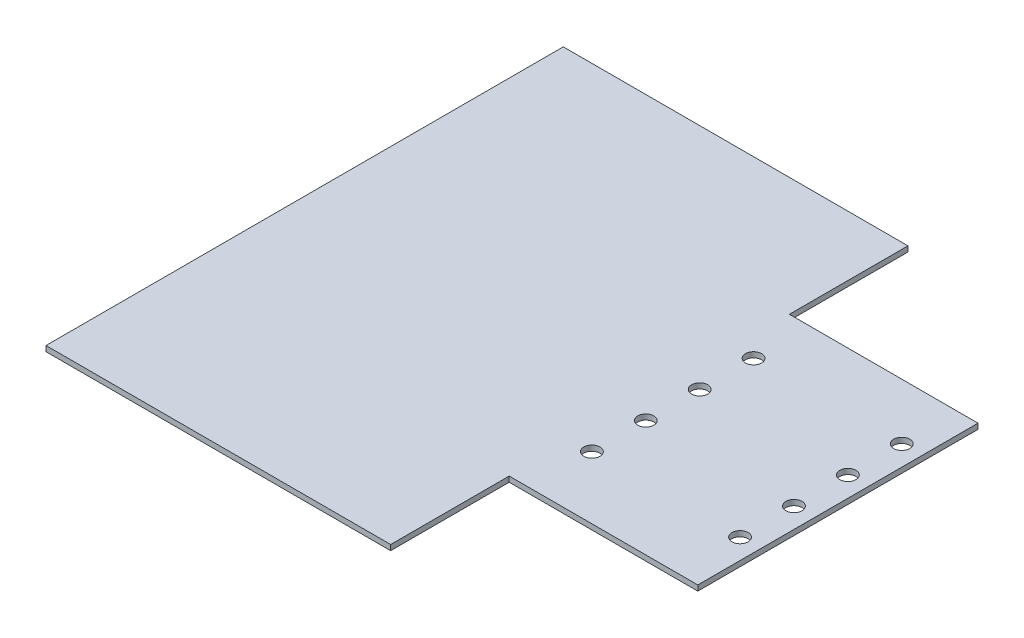
ISO-10303-21;
HEADER;
FILE_DESCRIPTION(('STEP AP214'),'2;1');
FILE_NAME('part.step','',(''),(''),'','','');
FILE_SCHEMA(('AUTOMOTIVE_DESIGN { 1 0 10303 214 1 1 1 1 }'));
ENDSEC;
DATA;
#1=APPLICATION_CONTEXT('core data for automotive mechanical design processes');
#2=APPLICATION_PROTOCOL_DEFINITION('international standard','automotive_design',2000,#1);
#3=PRODUCT_CONTEXT('',#1,'mechanical');
#4=PRODUCT('Part','Part','',(#3));
#5=PRODUCT_RELATED_PRODUCT_CATEGORY('part','',(#4));
#6=PRODUCT_DEFINITION_FORMATION('','',#4);
#7=PRODUCT_DEFINITION_CONTEXT('part definition',#1,'design');
#8=PRODUCT_DEFINITION('design','',#6,#7);
#9=PRODUCT_DEFINITION_SHAPE('','',#8);
#10=(LENGTH_UNIT() NAMED_UNIT(*) SI_UNIT(.MILLI.,.METRE.));
#11=(NAMED_UNIT(*) PLANE_ANGLE_UNIT() SI_UNIT($,.RADIAN.));
#12=(NAMED_UNIT(*) SI_UNIT($,.STERADIAN.) SOLID_ANGLE_UNIT());
#13=UNCERTAINTY_MEASURE_WITH_UNIT(LENGTH_MEASURE(1.E-05),#10,'distance_accuracy_value','');
#14=(GEOMETRIC_REPRESENTATION_CONTEXT(3) GLOBAL_UNCERTAINTY_ASSIGNED_CONTEXT((#13)) GLOBAL_UNIT_ASSIGNED_CONTEXT((#10,
#11,#12)) REPRESENTATION_CONTEXT('',''));
#15=CARTESIAN_POINT('',(0.,0.,0.));
#16=DIRECTION('',(0.,0.,1.));
#17=DIRECTION('',(1.,0.,0.));
#18=AXIS2_PLACEMENT_3D('',#15,#16,#17);
#19=CARTESIAN_POINT('',(-48.9590812442226,1.,47.9999999999896));
#20=DIRECTION('',(0.,0.,-1.));
#21=DIRECTION('',(-1.,0.,0.));
#22=AXIS2_PLACEMENT_3D('',#19,#20,#21);
#23=PLANE('',#22);
#24=DIRECTION('',(1.,0.,0.));
#25=VECTOR('',#24,1.);
#26=CARTESIAN_POINT('',(-48.9590812442226,0.,47.9999999999896));
#27=LINE('',#26,#25);
#28=CARTESIAN_POINT('',(-48.9590812442226,0.,47.9999999999896));
#29=VERTEX_POINT('',#28);
#30=CARTESIAN_POINT('',(15.,0.,47.9999999999896));
#31=VERTEX_POINT('',#30);
#32=EDGE_CURVE('E136',#29,#31,#27,.T.);
#33=ORIENTED_EDGE('',*,*,#32,.T.);
#34=DIRECTION('',(0.,-1.,0.));
#35=VECTOR('',#34,1.);
#36=CARTESIAN_POINT('',(15.,1.,47.9999999999896));
#37=LINE('',#36,#35);
#38=CARTESIAN_POINT('',(15.,1.,47.9999999999896));
#39=VERTEX_POINT('',#38);
#40=EDGE_CURVE('E11',#39,#31,#37,.T.);
#41=ORIENTED_EDGE('',*,*,#40,.F.);
#42=DIRECTION('',(1.,0.,0.));
#43=VECTOR('',#42,1.);
#44=CARTESIAN_POINT('',(-48.9590812442226,1.,47.9999999999896));
#45=LINE('',#44,#43);
#46=CARTESIAN_POINT('',(-48.9590812442226,1.,47.9999999999896));
#47=VERTEX_POINT('',#46);
#48=EDGE_CURVE('E150',#47,#39,#45,.T.);
#49=ORIENTED_EDGE('',*,*,#48,.F.);
#50=DIRECTION('',(0.,-1.,0.));
#51=VECTOR('',#50,1.);
#52=CARTESIAN_POINT('',(-48.9590812442226,1.,47.9999999999896));
#53=LINE('',#52,#51);
#54=EDGE_CURVE('E132',#47,#29,#53,.T.);
#55=ORIENTED_EDGE('',*,*,#54,.T.);
#56=EDGE_LOOP('',(#33,#41,#49,#55));
#57=FACE_BOUND('',#56,.T.);
#58=ADVANCED_FACE('F38',(#57),#23,.F.);
#59=CARTESIAN_POINT('',(15.,1.,26.));
#60=DIRECTION('',(-1.,0.,0.));
#61=DIRECTION('',(0.,0.,1.));
#62=AXIS2_PLACEMENT_3D('',#59,#60,#61);
#63=PLANE('',#62);
#64=DIRECTION('',(0.,0.,-1.));
#65=VECTOR('',#64,1.);
#66=CARTESIAN_POINT('',(15.,0.,26.));
#67=LINE('',#66,#65);
#68=CARTESIAN_POINT('',(15.,0.,26.));
#69=VERTEX_POINT('',#68);
#70=EDGE_CURVE('E139',#31,#69,#67,.T.);
#71=ORIENTED_EDGE('',*,*,#70,.T.);
#72=DIRECTION('',(0.,-1.,0.));
#73=VECTOR('',#72,1.);
#74=CARTESIAN_POINT('',(15.,1.,26.));
#75=LINE('',#74,#73);
#76=CARTESIAN_POINT('',(15.,1.,26.));
#77=VERTEX_POINT('',#76);
#78=EDGE_CURVE('E47',#77,#69,#75,.T.);
#79=ORIENTED_EDGE('',*,*,#78,.F.);
#80=DIRECTION('',(0.,0.,-1.));
#81=VECTOR('',#80,1.);
#82=CARTESIAN_POINT('',(15.,1.,26.));
#83=LINE('',#82,#81);
#84=EDGE_CURVE('E99',#39,#77,#83,.T.);
#85=ORIENTED_EDGE('',*,*,#84,.F.);
#86=ORIENTED_EDGE('',*,*,#40,.T.);
#87=EDGE_LOOP('',(#71,#79,#85,#86));
#88=FACE_BOUND('',#87,.T.);
#89=ADVANCED_FACE('F224',(#88),#63,.F.);
#90=CARTESIAN_POINT('',(50.,1.,26.));
#91=DIRECTION('',(0.,0.,-1.));
#92=DIRECTION('',(-1.,0.,0.));
#93=AXIS2_PLACEMENT_3D('',#90,#91,#92);
#94=PLANE('',#93);
#95=DIRECTION('',(1.,0.,0.));
#96=VECTOR('',#95,1.);
#97=CARTESIAN_POINT('',(50.,0.,26.));
#98=LINE('',#97,#96);
#99=CARTESIAN_POINT('',(50.,0.,26.));
#100=VERTEX_POINT('',#99);
#101=EDGE_CURVE('E141',#69,#100,#98,.T.);
#102=ORIENTED_EDGE('',*,*,#101,.T.);
#103=DIRECTION('',(0.,-1.,0.));
#104=VECTOR('',#103,1.);
#105=CARTESIAN_POINT('',(50.,1.,26.));
#106=LINE('',#105,#104);
#107=CARTESIAN_POINT('',(50.,1.,26.));
#108=VERTEX_POINT('',#107);
#109=EDGE_CURVE('E157',#108,#100,#106,.T.);
#110=ORIENTED_EDGE('',*,*,#109,.F.);
#111=DIRECTION('',(1.,0.,0.));
#112=VECTOR('',#111,1.);
#113=CARTESIAN_POINT('',(50.,1.,26.));
#114=LINE('',#113,#112);
#115=EDGE_CURVE('E418',#77,#108,#114,.T.);
#116=ORIENTED_EDGE('',*,*,#115,.F.);
#117=ORIENTED_EDGE('',*,*,#78,.T.);
#118=EDGE_LOOP('',(#102,#110,#116,#117));
#119=FACE_BOUND('',#118,.T.);
#120=ADVANCED_FACE('F228',(#119),#94,.F.);
#121=CARTESIAN_POINT('',(50.,1.,-26.0000000000104));
#122=DIRECTION('',(-1.,0.,0.));
#123=DIRECTION('',(0.,0.,1.));
#124=AXIS2_PLACEMENT_3D('',#121,#122,#123);
#125=PLANE('',#124);
#126=DIRECTION('',(0.,0.,-1.));
#127=VECTOR('',#126,1.);
#128=CARTESIAN_POINT('',(50.,0.,-26.0000000000104));
#129=LINE('',#128,#127);
#130=CARTESIAN_POINT('',(50.,0.,-26.0000000000104));
#131=VERTEX_POINT('',#130);
#132=EDGE_CURVE('E143',#100,#131,#129,.T.);
#133=ORIENTED_EDGE('',*,*,#132,.T.);
#134=DIRECTION('',(0.,-1.,0.));
#135=VECTOR('',#134,1.);
#136=CARTESIAN_POINT('',(50.,1.,-26.0000000000104));
#137=LINE('',#136,#135);
#138=CARTESIAN_POINT('',(50.,1.,-26.0000000000104));
#139=VERTEX_POINT('',#138);
#140=EDGE_CURVE('E154',#139,#131,#137,.T.);
#141=ORIENTED_EDGE('',*,*,#140,.F.);
#142=DIRECTION('',(0.,0.,-1.));
#143=VECTOR('',#142,1.);
#144=CARTESIAN_POINT('',(50.,1.,-26.0000000000104));
#145=LINE('',#144,#143);
#146=EDGE_CURVE('E420',#108,#139,#145,.T.);
#147=ORIENTED_EDGE('',*,*,#146,.F.);
#148=ORIENTED_EDGE('',*,*,#109,.T.);
#149=EDGE_LOOP('',(#133,#141,#147,#148));
#150=FACE_BOUND('',#149,.T.);
#151=ADVANCED_FACE('F232',(#150),#125,.F.);
#152=CARTESIAN_POINT('',(50.,1.,-26.0000000000104));
#153=DIRECTION('',(0.,0.,1.));
#154=DIRECTION('',(1.,0.,0.));
#155=AXIS2_PLACEMENT_3D('',#152,#153,#154);
#156=PLANE('',#155);
#157=DIRECTION('',(-1.,0.,0.));
#158=VECTOR('',#157,1.);
#159=CARTESIAN_POINT('',(50.,0.,-26.0000000000104));
#160=LINE('',#159,#158);
#161=CARTESIAN_POINT('',(15.,0.,-26.0000000000104));
#162=VERTEX_POINT('',#161);
#163=EDGE_CURVE('E145',#131,#162,#160,.T.);
#164=ORIENTED_EDGE('',*,*,#163,.T.);
#165=DIRECTION('',(0.,-1.,0.));
#166=VECTOR('',#165,1.);
#167=CARTESIAN_POINT('',(15.,1.,-26.0000000000104));
#168=LINE('',#167,#166);
#169=CARTESIAN_POINT('',(15.,1.,-26.0000000000104));
#170=VERTEX_POINT('',#169);
#171=EDGE_CURVE('E127',#170,#162,#168,.T.);
#172=ORIENTED_EDGE('',*,*,#171,.F.);
#173=DIRECTION('',(-1.,0.,0.));
#174=VECTOR('',#173,1.);
#175=CARTESIAN_POINT('',(50.,1.,-26.0000000000104));
#176=LINE('',#175,#174);
#177=EDGE_CURVE('E118',#139,#170,#176,.T.);
#178=ORIENTED_EDGE('',*,*,#177,.F.);
#179=ORIENTED_EDGE('',*,*,#140,.T.);
#180=EDGE_LOOP('',(#164,#172,#178,#179));
#181=FACE_BOUND('',#180,.T.);
#182=ADVANCED_FACE('F238',(#181),#156,.F.);
#183=CARTESIAN_POINT('',(15.,1.,-48.));
#184=DIRECTION('',(-1.,0.,0.));
#185=DIRECTION('',(0.,0.,1.));
#186=AXIS2_PLACEMENT_3D('',#183,#184,#185);
#187=PLANE('',#186);
#188=DIRECTION('',(0.,0.,-1.));
#189=VECTOR('',#188,1.);
#190=CARTESIAN_POINT('',(15.,0.,-48.));
#191=LINE('',#190,#189);
#192=CARTESIAN_POINT('',(15.,0.,-48.));
#193=VERTEX_POINT('',#192);
#194=EDGE_CURVE('E126',#162,#193,#191,.T.);
#195=ORIENTED_EDGE('',*,*,#194,.T.);
#196=DIRECTION('',(0.,-1.,0.));
#197=VECTOR('',#196,1.);
#198=CARTESIAN_POINT('',(15.,1.,-48.));
#199=LINE('',#198,#197);
#200=CARTESIAN_POINT('',(15.,1.,-48.));
#201=VERTEX_POINT('',#200);
#202=EDGE_CURVE('E123',#201,#193,#199,.T.);
#203=ORIENTED_EDGE('',*,*,#202,.F.);
#204=DIRECTION('',(0.,0.,-1.));
#205=VECTOR('',#204,1.);
#206=CARTESIAN_POINT('',(15.,1.,-48.));
#207=LINE('',#206,#205);
#208=EDGE_CURVE('E112',#170,#201,#207,.T.);
#209=ORIENTED_EDGE('',*,*,#208,.F.);
#210=ORIENTED_EDGE('',*,*,#171,.T.);
#211=EDGE_LOOP('',(#195,#203,#209,#210));
#212=FACE_BOUND('',#211,.T.);
#213=ADVANCED_FACE('F124',(#212),#187,.F.);
#214=CARTESIAN_POINT('',(-48.9590812442226,1.,-48.));
#215=DIRECTION('',(0.,0.,1.));
#216=DIRECTION('',(1.,0.,0.));
#217=AXIS2_PLACEMENT_3D('',#214,#215,#216);
#218=PLANE('',#217);
#219=DIRECTION('',(-1.,0.,0.));
#220=VECTOR('',#219,1.);
#221=CARTESIAN_POINT('',(-48.9590812442226,0.,-48.));
#222=LINE('',#221,#220);
#223=CARTESIAN_POINT('',(-48.9590812442226,0.,-48.));
#224=VERTEX_POINT('',#223);
#225=EDGE_CURVE('E85',#193,#224,#222,.T.);
#226=ORIENTED_EDGE('',*,*,#225,.T.);
#227=DIRECTION('',(0.,-1.,0.));
#228=VECTOR('',#227,1.);
#229=CARTESIAN_POINT('',(-48.9590812442226,1.,-48.));
#230=LINE('',#229,#228);
#231=CARTESIAN_POINT('',(-48.9590812442226,1.,-48.));
#232=VERTEX_POINT('',#231);
#233=EDGE_CURVE('E128',#232,#224,#230,.T.);
#234=ORIENTED_EDGE('',*,*,#233,.F.);
#235=DIRECTION('',(-1.,0.,0.));
#236=VECTOR('',#235,1.);
#237=CARTESIAN_POINT('',(-48.9590812442226,1.,-48.));
#238=LINE('',#237,#236);
#239=EDGE_CURVE('E116',#201,#232,#238,.T.);
#240=ORIENTED_EDGE('',*,*,#239,.F.);
#241=ORIENTED_EDGE('',*,*,#202,.T.);
#242=EDGE_LOOP('',(#226,#234,#240,#241));
#243=FACE_BOUND('',#242,.T.);
#244=ADVANCED_FACE('F130',(#243),#218,.F.);
#245=CARTESIAN_POINT('',(-48.9590812442226,1.,-48.));
#246=DIRECTION('',(1.,0.,0.));
#247=DIRECTION('',(0.,0.,-1.));
#248=AXIS2_PLACEMENT_3D('',#245,#246,#247);
#249=PLANE('',#248);
#250=DIRECTION('',(0.,0.,1.));
#251=VECTOR('',#250,1.);
#252=CARTESIAN_POINT('',(-48.9590812442226,0.,-48.));
#253=LINE('',#252,#251);
#254=EDGE_CURVE('E91',#224,#29,#253,.T.);
#255=ORIENTED_EDGE('',*,*,#254,.T.);
#256=ORIENTED_EDGE('',*,*,#54,.F.);
#257=DIRECTION('',(0.,0.,1.));
#258=VECTOR('',#257,1.);
#259=CARTESIAN_POINT('',(-48.9590812442226,1.,-48.));
#260=LINE('',#259,#258);
#261=EDGE_CURVE('E56',#232,#47,#260,.T.);
#262=ORIENTED_EDGE('',*,*,#261,.F.);
#263=ORIENTED_EDGE('',*,*,#233,.T.);
#264=EDGE_LOOP('',(#255,#256,#262,#263));
#265=FACE_BOUND('',#264,.T.);
#266=ADVANCED_FACE('F213',(#265),#249,.F.);
#267=CARTESIAN_POINT('',(0.,1.,0.));
#268=DIRECTION('',(0.,-1.,0.));
#269=DIRECTION('',(0.,0.,-1.));
#270=AXIS2_PLACEMENT_3D('',#267,#268,#269);
#271=PLANE('',#270);
#272=CARTESIAN_POINT('',(46.25,1.,-5.60000000000047));
#273=DIRECTION('',(0.,1.,0.));
#274=DIRECTION('',(0.,0.,1.));
#275=AXIS2_PLACEMENT_3D('',#272,#273,#274);
#276=CIRCLE('',#275,1.50000000000983);
#277=CARTESIAN_POINT('',(46.25,1.,-4.09999999999064));
#278=VERTEX_POINT('',#277);
#279=EDGE_CURVE('E400',#278,#278,#276,.T.);
#280=ORIENTED_EDGE('',*,*,#279,.F.);
#281=EDGE_LOOP('',(#280));
#282=FACE_BOUND('',#281,.T.);
#283=CARTESIAN_POINT('',(18.75,1.,4.39999999999953));
#284=DIRECTION('',(0.,1.,0.));
#285=DIRECTION('',(0.,0.,1.));
#286=AXIS2_PLACEMENT_3D('',#283,#284,#285);
#287=CIRCLE('',#286,1.50000000000935);
#288=CARTESIAN_POINT('',(18.75,1.,5.90000000000888));
#289=VERTEX_POINT('',#288);
#290=EDGE_CURVE('E397',#289,#289,#287,.T.);
#291=ORIENTED_EDGE('',*,*,#290,.F.);
#292=EDGE_LOOP('',(#291));
#293=FACE_BOUND('',#292,.T.);
#294=CARTESIAN_POINT('',(46.25,1.,4.39999999999953));
#295=DIRECTION('',(0.,1.,0.));
#296=DIRECTION('',(0.,0.,1.));
#297=AXIS2_PLACEMENT_3D('',#294,#295,#296);
#298=CIRCLE('',#297,1.50000000000983);
#299=CARTESIAN_POINT('',(46.25,1.,5.90000000000936));
#300=VERTEX_POINT('',#299);
#301=EDGE_CURVE('E399',#300,#300,#298,.T.);
#302=ORIENTED_EDGE('',*,*,#301,.F.);
#303=EDGE_LOOP('',(#302));
#304=FACE_BOUND('',#303,.T.);
#305=CARTESIAN_POINT('',(18.75,1.,14.3999999999995));
#306=DIRECTION('',(0.,1.,0.));
#307=DIRECTION('',(0.,0.,1.));
#308=AXIS2_PLACEMENT_3D('',#305,#306,#307);
#309=CIRCLE('',#308,1.50000000000935);
#310=CARTESIAN_POINT('',(18.75,1.,15.9000000000089));
#311=VERTEX_POINT('',#310);
#312=EDGE_CURVE('E403',#311,#311,#309,.T.);
#313=ORIENTED_EDGE('',*,*,#312,.F.);
#314=EDGE_LOOP('',(#313));
#315=FACE_BOUND('',#314,.T.);
#316=CARTESIAN_POINT('',(18.7499999999999,1.,-15.6000000000005));
#317=DIRECTION('',(0.,1.,0.));
#318=DIRECTION('',(0.,0.,1.));
#319=AXIS2_PLACEMENT_3D('',#316,#317,#318);
#320=CIRCLE('',#319,1.50000000000935);
#321=CARTESIAN_POINT('',(18.7499999999999,1.,-14.0999999999911));
#322=VERTEX_POINT('',#321);
#323=EDGE_CURVE('E437',#322,#322,#320,.T.);
#324=ORIENTED_EDGE('',*,*,#323,.F.);
#325=EDGE_LOOP('',(#324));
#326=FACE_BOUND('',#325,.T.);
#327=CARTESIAN_POINT('',(46.2499999999999,1.,-15.6000000000005));
#328=DIRECTION('',(0.,1.,0.));
#329=DIRECTION('',(0.,0.,1.));
#330=AXIS2_PLACEMENT_3D('',#327,#328,#329);
#331=CIRCLE('',#330,1.50000000000983);
#332=CARTESIAN_POINT('',(46.2499999999999,1.,-14.0999999999906));
#333=VERTEX_POINT('',#332);
#334=EDGE_CURVE('E409',#333,#333,#331,.T.);
#335=ORIENTED_EDGE('',*,*,#334,.F.);
#336=EDGE_LOOP('',(#335));
#337=FACE_BOUND('',#336,.T.);
#338=CARTESIAN_POINT('',(18.75,1.,-5.60000000000047));
#339=DIRECTION('',(0.,1.,0.));
#340=DIRECTION('',(0.,0.,1.));
#341=AXIS2_PLACEMENT_3D('',#338,#339,#340);
#342=CIRCLE('',#341,1.50000000000935);
#343=CARTESIAN_POINT('',(18.75,1.,-4.09999999999112));
#344=VERTEX_POINT('',#343);
#345=EDGE_CURVE('E406',#344,#344,#342,.T.);
#346=ORIENTED_EDGE('',*,*,#345,.F.);
#347=EDGE_LOOP('',(#346));
#348=FACE_BOUND('',#347,.T.);
#349=CARTESIAN_POINT('',(46.25,1.,14.3999999999995));
#350=DIRECTION('',(0.,1.,0.));
#351=DIRECTION('',(0.,0.,1.));
#352=AXIS2_PLACEMENT_3D('',#349,#350,#351);
#353=CIRCLE('',#352,1.50000000000983);
#354=CARTESIAN_POINT('',(46.25,1.,15.9000000000094));
#355=VERTEX_POINT('',#354);
#356=EDGE_CURVE('E166',#355,#355,#353,.T.);
#357=ORIENTED_EDGE('',*,*,#356,.F.);
#358=EDGE_LOOP('',(#357));
#359=FACE_BOUND('',#358,.T.);
#360=ORIENTED_EDGE('',*,*,#48,.T.);
#361=ORIENTED_EDGE('',*,*,#84,.T.);
#362=ORIENTED_EDGE('',*,*,#115,.T.);
#363=ORIENTED_EDGE('',*,*,#146,.T.);
#364=ORIENTED_EDGE('',*,*,#177,.T.);
#365=ORIENTED_EDGE('',*,*,#208,.T.);
#366=ORIENTED_EDGE('',*,*,#239,.T.);
#367=ORIENTED_EDGE('',*,*,#261,.T.);
#368=EDGE_LOOP('',(#360,#361,#362,#363,#364,#365,#366,#367));
#369=FACE_BOUND('',#368,.T.);
#370=ADVANCED_FACE('F114',(#282,#293,#304,#315,#326,#337,#348,#359,#369),#271,.F.);
#371=CARTESIAN_POINT('',(0.,0.,0.));
#372=DIRECTION('',(0.,-1.,0.));
#373=DIRECTION('',(0.,0.,-1.));
#374=AXIS2_PLACEMENT_3D('',#371,#372,#373);
#375=PLANE('',#374);
#376=CARTESIAN_POINT('',(46.25,0.,-5.60000000000047));
#377=DIRECTION('',(0.,-1.,0.));
#378=DIRECTION('',(0.,0.,-1.));
#379=AXIS2_PLACEMENT_3D('',#376,#377,#378);
#380=CIRCLE('',#379,1.50000000000983);
#381=CARTESIAN_POINT('',(46.25,0.,-7.10000000001031));
#382=VERTEX_POINT('',#381);
#383=EDGE_CURVE('E41',#382,#382,#380,.T.);
#384=ORIENTED_EDGE('',*,*,#383,.F.);
#385=EDGE_LOOP('',(#384));
#386=FACE_BOUND('',#385,.T.);
#387=CARTESIAN_POINT('',(18.75,0.,4.39999999999953));
#388=DIRECTION('',(0.,-1.,0.));
#389=DIRECTION('',(0.,0.,-1.));
#390=AXIS2_PLACEMENT_3D('',#387,#388,#389);
#391=CIRCLE('',#390,1.50000000000935);
#392=CARTESIAN_POINT('',(18.75,0.,2.89999999999018));
#393=VERTEX_POINT('',#392);
#394=EDGE_CURVE('E180',#393,#393,#391,.T.);
#395=ORIENTED_EDGE('',*,*,#394,.F.);
#396=EDGE_LOOP('',(#395));
#397=FACE_BOUND('',#396,.T.);
#398=CARTESIAN_POINT('',(46.25,0.,4.39999999999953));
#399=DIRECTION('',(0.,-1.,0.));
#400=DIRECTION('',(0.,0.,-1.));
#401=AXIS2_PLACEMENT_3D('',#398,#399,#400);
#402=CIRCLE('',#401,1.50000000000983);
#403=CARTESIAN_POINT('',(46.25,0.,2.89999999998969));
#404=VERTEX_POINT('',#403);
#405=EDGE_CURVE('E178',#404,#404,#402,.T.);
#406=ORIENTED_EDGE('',*,*,#405,.F.);
#407=EDGE_LOOP('',(#406));
#408=FACE_BOUND('',#407,.T.);
#409=CARTESIAN_POINT('',(18.75,0.,14.3999999999995));
#410=DIRECTION('',(0.,-1.,0.));
#411=DIRECTION('',(0.,0.,-1.));
#412=AXIS2_PLACEMENT_3D('',#409,#410,#411);
#413=CIRCLE('',#412,1.50000000000935);
#414=CARTESIAN_POINT('',(18.75,0.,12.8999999999902));
#415=VERTEX_POINT('',#414);
#416=EDGE_CURVE('E175',#415,#415,#413,.T.);
#417=ORIENTED_EDGE('',*,*,#416,.F.);
#418=EDGE_LOOP('',(#417));
#419=FACE_BOUND('',#418,.T.);
#420=CARTESIAN_POINT('',(18.7499999999999,0.,-15.6000000000005));
#421=DIRECTION('',(0.,-1.,0.));
#422=DIRECTION('',(0.,0.,-1.));
#423=AXIS2_PLACEMENT_3D('',#420,#421,#422);
#424=CIRCLE('',#423,1.50000000000935);
#425=CARTESIAN_POINT('',(18.7499999999999,0.,-17.1000000000098));
#426=VERTEX_POINT('',#425);
#427=EDGE_CURVE('E172',#426,#426,#424,.T.);
#428=ORIENTED_EDGE('',*,*,#427,.F.);
#429=EDGE_LOOP('',(#428));
#430=FACE_BOUND('',#429,.T.);
#431=CARTESIAN_POINT('',(46.2499999999999,0.,-15.6000000000005));
#432=DIRECTION('',(0.,-1.,0.));
#433=DIRECTION('',(0.,0.,-1.));
#434=AXIS2_PLACEMENT_3D('',#431,#432,#433);
#435=CIRCLE('',#434,1.50000000000983);
#436=CARTESIAN_POINT('',(46.2499999999999,0.,-17.1000000000103));
#437=VERTEX_POINT('',#436);
#438=EDGE_CURVE('E169',#437,#437,#435,.T.);
#439=ORIENTED_EDGE('',*,*,#438,.F.);
#440=EDGE_LOOP('',(#439));
#441=FACE_BOUND('',#440,.T.);
#442=CARTESIAN_POINT('',(18.75,0.,-5.60000000000047));
#443=DIRECTION('',(0.,-1.,0.));
#444=DIRECTION('',(0.,0.,-1.));
#445=AXIS2_PLACEMENT_3D('',#442,#443,#444);
#446=CIRCLE('',#445,1.50000000000935);
#447=CARTESIAN_POINT('',(18.75,0.,-7.10000000000982));
#448=VERTEX_POINT('',#447);
#449=EDGE_CURVE('E165',#448,#448,#446,.T.);
#450=ORIENTED_EDGE('',*,*,#449,.F.);
#451=EDGE_LOOP('',(#450));
#452=FACE_BOUND('',#451,.T.);
#453=CARTESIAN_POINT('',(46.25,0.,14.3999999999995));
#454=DIRECTION('',(0.,-1.,0.));
#455=DIRECTION('',(0.,0.,-1.));
#456=AXIS2_PLACEMENT_3D('',#453,#454,#455);
#457=CIRCLE('',#456,1.50000000000983);
#458=CARTESIAN_POINT('',(46.25,0.,12.8999999999897));
#459=VERTEX_POINT('',#458);
#460=EDGE_CURVE('E162',#459,#459,#457,.T.);
#461=ORIENTED_EDGE('',*,*,#460,.F.);
#462=EDGE_LOOP('',(#461));
#463=FACE_BOUND('',#462,.T.);
#464=ORIENTED_EDGE('',*,*,#32,.F.);
#465=ORIENTED_EDGE('',*,*,#254,.F.);
#466=ORIENTED_EDGE('',*,*,#225,.F.);
#467=ORIENTED_EDGE('',*,*,#194,.F.);
#468=ORIENTED_EDGE('',*,*,#163,.F.);
#469=ORIENTED_EDGE('',*,*,#132,.F.);
#470=ORIENTED_EDGE('',*,*,#101,.F.);
#471=ORIENTED_EDGE('',*,*,#70,.F.);
#472=EDGE_LOOP('',(#464,#465,#466,#467,#468,#469,#470,#471));
#473=FACE_BOUND('',#472,.T.);
#474=ADVANCED_FACE('F190',(#386,#397,#408,#419,#430,#441,#452,#463,#473),#375,.T.);
#475=CARTESIAN_POINT('',(46.25,-9.,14.3999999999995));
#476=DIRECTION('',(0.,1.,0.));
#477=DIRECTION('',(0.,0.,1.));
#478=AXIS2_PLACEMENT_3D('',#475,#476,#477);
#479=CYLINDRICAL_SURFACE('',#478,1.50000000000983);
#480=ORIENTED_EDGE('',*,*,#460,.T.);
#481=EDGE_LOOP('',(#480));
#482=FACE_BOUND('',#481,.T.);
#483=ORIENTED_EDGE('',*,*,#356,.T.);
#484=EDGE_LOOP('',(#483));
#485=FACE_BOUND('',#484,.T.);
#486=ADVANCED_FACE('F193',(#482,#485),#479,.F.);
#487=CARTESIAN_POINT('',(18.75,-9.,-5.60000000000047));
#488=DIRECTION('',(0.,1.,0.));
#489=DIRECTION('',(0.,0.,1.));
#490=AXIS2_PLACEMENT_3D('',#487,#488,#489);
#491=CYLINDRICAL_SURFACE('',#490,1.50000000000935);
#492=ORIENTED_EDGE('',*,*,#449,.T.);
#493=EDGE_LOOP('',(#492));
#494=FACE_BOUND('',#493,.T.);
#495=ORIENTED_EDGE('',*,*,#345,.T.);
#496=EDGE_LOOP('',(#495));
#497=FACE_BOUND('',#496,.T.);
#498=ADVANCED_FACE('F267',(#494,#497),#491,.F.);
#499=CARTESIAN_POINT('',(46.2499999999999,-9.,-15.6000000000005));
#500=DIRECTION('',(0.,1.,0.));
#501=DIRECTION('',(0.,0.,1.));
#502=AXIS2_PLACEMENT_3D('',#499,#500,#501);
#503=CYLINDRICAL_SURFACE('',#502,1.50000000000983);
#504=ORIENTED_EDGE('',*,*,#438,.T.);
#505=EDGE_LOOP('',(#504));
#506=FACE_BOUND('',#505,.T.);
#507=ORIENTED_EDGE('',*,*,#334,.T.);
#508=EDGE_LOOP('',(#507));
#509=FACE_BOUND('',#508,.T.);
#510=ADVANCED_FACE('F276',(#506,#509),#503,.F.);
#511=CARTESIAN_POINT('',(18.7499999999999,-9.,-15.6000000000005));
#512=DIRECTION('',(0.,1.,0.));
#513=DIRECTION('',(0.,0.,1.));
#514=AXIS2_PLACEMENT_3D('',#511,#512,#513);
#515=CYLINDRICAL_SURFACE('',#514,1.50000000000935);
#516=ORIENTED_EDGE('',*,*,#427,.T.);
#517=EDGE_LOOP('',(#516));
#518=FACE_BOUND('',#517,.T.);
#519=ORIENTED_EDGE('',*,*,#323,.T.);
#520=EDGE_LOOP('',(#519));
#521=FACE_BOUND('',#520,.T.);
#522=ADVANCED_FACE('F285',(#518,#521),#515,.F.);
#523=CARTESIAN_POINT('',(18.75,-9.,14.3999999999995));
#524=DIRECTION('',(0.,1.,0.));
#525=DIRECTION('',(0.,0.,1.));
#526=AXIS2_PLACEMENT_3D('',#523,#524,#525);
#527=CYLINDRICAL_SURFACE('',#526,1.50000000000935);
#528=ORIENTED_EDGE('',*,*,#416,.T.);
#529=EDGE_LOOP('',(#528));
#530=FACE_BOUND('',#529,.T.);
#531=ORIENTED_EDGE('',*,*,#312,.T.);
#532=EDGE_LOOP('',(#531));
#533=FACE_BOUND('',#532,.T.);
#534=ADVANCED_FACE('F294',(#530,#533),#527,.F.);
#535=CARTESIAN_POINT('',(46.25,-9.,4.39999999999953));
#536=DIRECTION('',(0.,1.,0.));
#537=DIRECTION('',(0.,0.,1.));
#538=AXIS2_PLACEMENT_3D('',#535,#536,#537);
#539=CYLINDRICAL_SURFACE('',#538,1.50000000000983);
#540=ORIENTED_EDGE('',*,*,#405,.T.);
#541=EDGE_LOOP('',(#540));
#542=FACE_BOUND('',#541,.T.);
#543=ORIENTED_EDGE('',*,*,#301,.T.);
#544=EDGE_LOOP('',(#543));
#545=FACE_BOUND('',#544,.T.);
#546=ADVANCED_FACE('F303',(#542,#545),#539,.F.);
#547=CARTESIAN_POINT('',(18.75,-9.,4.39999999999953));
#548=DIRECTION('',(0.,1.,0.));
#549=DIRECTION('',(0.,0.,1.));
#550=AXIS2_PLACEMENT_3D('',#547,#548,#549);
#551=CYLINDRICAL_SURFACE('',#550,1.50000000000935);
#552=ORIENTED_EDGE('',*,*,#394,.T.);
#553=EDGE_LOOP('',(#552));
#554=FACE_BOUND('',#553,.T.);
#555=ORIENTED_EDGE('',*,*,#290,.T.);
#556=EDGE_LOOP('',(#555));
#557=FACE_BOUND('',#556,.T.);
#558=ADVANCED_FACE('F312',(#554,#557),#551,.F.);
#559=CARTESIAN_POINT('',(46.25,-9.,-5.60000000000047));
#560=DIRECTION('',(0.,1.,0.));
#561=DIRECTION('',(0.,0.,1.));
#562=AXIS2_PLACEMENT_3D('',#559,#560,#561);
#563=CYLINDRICAL_SURFACE('',#562,1.50000000000983);
#564=ORIENTED_EDGE('',*,*,#383,.T.);
#565=EDGE_LOOP('',(#564));
#566=FACE_BOUND('',#565,.T.);
#567=ORIENTED_EDGE('',*,*,#279,.T.);
#568=EDGE_LOOP('',(#567));
#569=FACE_BOUND('',#568,.T.);
#570=ADVANCED_FACE('F187',(#566,#569),#563,.F.);
#571=CLOSED_SHELL('',(#58,#89,#120,#151,#182,#213,#244,#266,#370,#474,#486,#498,#510,#522,#534,
#546,#558,#570));
#572=MANIFOLD_SOLID_BREP('B2',#571);
#573=ADVANCED_BREP_SHAPE_REPRESENTATION('',(#18,#572),#14);
#574=SHAPE_DEFINITION_REPRESENTATION(#9,#573);
ENDSEC;
END-ISO-10303-21;
